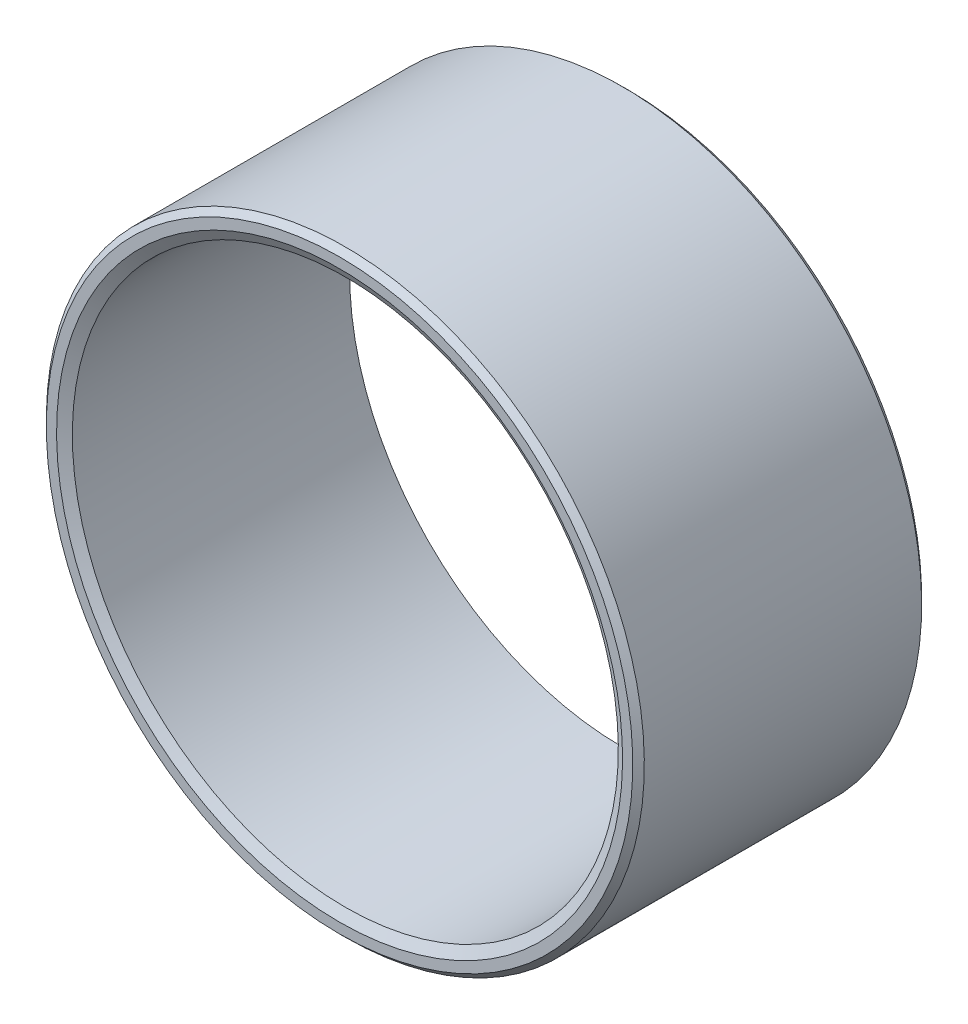
ISO-10303-21;
HEADER;
FILE_DESCRIPTION(('STEP AP214'),'2;1');
FILE_NAME('part.step','',(''),(''),'','','');
FILE_SCHEMA(('AUTOMOTIVE_DESIGN { 1 0 10303 214 1 1 1 1 }'));
ENDSEC;
DATA;
#1=APPLICATION_CONTEXT('core data for automotive mechanical design processes');
#2=APPLICATION_PROTOCOL_DEFINITION('international standard','automotive_design',2000,#1);
#3=PRODUCT_CONTEXT('',#1,'mechanical');
#4=PRODUCT('Part','Part','',(#3));
#5=PRODUCT_RELATED_PRODUCT_CATEGORY('part','',(#4));
#6=PRODUCT_DEFINITION_FORMATION('','',#4);
#7=PRODUCT_DEFINITION_CONTEXT('part definition',#1,'design');
#8=PRODUCT_DEFINITION('design','',#6,#7);
#9=PRODUCT_DEFINITION_SHAPE('','',#8);
#10=(LENGTH_UNIT() NAMED_UNIT(*) SI_UNIT(.MILLI.,.METRE.));
#11=(NAMED_UNIT(*) PLANE_ANGLE_UNIT() SI_UNIT($,.RADIAN.));
#12=(NAMED_UNIT(*) SI_UNIT($,.STERADIAN.) SOLID_ANGLE_UNIT());
#13=UNCERTAINTY_MEASURE_WITH_UNIT(LENGTH_MEASURE(1.E-05),#10,'distance_accuracy_value','');
#14=(GEOMETRIC_REPRESENTATION_CONTEXT(3) GLOBAL_UNCERTAINTY_ASSIGNED_CONTEXT((#13)) GLOBAL_UNIT_ASSIGNED_CONTEXT((#10,
#11,#12)) REPRESENTATION_CONTEXT('',''));
#15=CARTESIAN_POINT('',(0.,0.,0.));
#16=DIRECTION('',(0.,0.,1.));
#17=DIRECTION('',(1.,0.,0.));
#18=AXIS2_PLACEMENT_3D('',#15,#16,#17);
#19=CARTESIAN_POINT('',(0.,0.,0.));
#20=DIRECTION('',(0.,0.,1.));
#21=DIRECTION('',(0.,-1.,0.));
#22=AXIS2_PLACEMENT_3D('',#19,#20,#21);
#23=CONICAL_SURFACE('',#22,12.4414409051225,1.04719755119659);
#24=CARTESIAN_POINT('',(0.,0.,-0.254));
#25=DIRECTION('',(0.,0.,1.));
#26=DIRECTION('',(0.,-1.,0.));
#27=AXIS2_PLACEMENT_3D('',#24,#25,#26);
#28=CIRCLE('',#27,12.0015);
#29=CARTESIAN_POINT('',(0.,-12.0015,-0.254));
#30=VERTEX_POINT('',#29);
#31=EDGE_CURVE('E9',#30,#30,#28,.T.);
#32=ORIENTED_EDGE('',*,*,#31,.F.);
#33=EDGE_LOOP('',(#32));
#34=FACE_BOUND('',#33,.T.);
#35=CARTESIAN_POINT('',(0.,0.,0.));
#36=DIRECTION('',(0.,0.,1.));
#37=DIRECTION('',(0.,-1.,0.));
#38=AXIS2_PLACEMENT_3D('',#35,#36,#37);
#39=CIRCLE('',#38,12.4414409051225);
#40=CARTESIAN_POINT('',(0.,-12.4414409051225,0.));
#41=VERTEX_POINT('',#40);
#42=EDGE_CURVE('E42',#41,#41,#39,.T.);
#43=ORIENTED_EDGE('',*,*,#42,.T.);
#44=EDGE_LOOP('',(#43));
#45=FACE_BOUND('',#44,.T.);
#46=ADVANCED_FACE('F14',(#34,#45),#23,.F.);
#47=CARTESIAN_POINT('',(0.,0.,0.));
#48=DIRECTION('',(0.,0.,1.));
#49=DIRECTION('',(0.,-1.,0.));
#50=AXIS2_PLACEMENT_3D('',#47,#48,#49);
#51=CYLINDRICAL_SURFACE('',#50,12.0015);
#52=CARTESIAN_POINT('',(0.,0.,-12.446));
#53=DIRECTION('',(0.,0.,1.));
#54=DIRECTION('',(0.,-1.,0.));
#55=AXIS2_PLACEMENT_3D('',#52,#53,#54);
#56=CIRCLE('',#55,12.0015);
#57=CARTESIAN_POINT('',(0.,-12.0015,-12.446));
#58=VERTEX_POINT('',#57);
#59=EDGE_CURVE('E20',#58,#58,#56,.T.);
#60=ORIENTED_EDGE('',*,*,#59,.F.);
#61=EDGE_LOOP('',(#60));
#62=FACE_BOUND('',#61,.T.);
#63=ORIENTED_EDGE('',*,*,#31,.T.);
#64=EDGE_LOOP('',(#63));
#65=FACE_BOUND('',#64,.T.);
#66=ADVANCED_FACE('F79',(#62,#65),#51,.F.);
#67=CARTESIAN_POINT('',(0.,0.,-12.446));
#68=DIRECTION('',(0.,0.,-1.));
#69=DIRECTION('',(0.,1.,0.));
#70=AXIS2_PLACEMENT_3D('',#67,#68,#69);
#71=CONICAL_SURFACE('',#70,12.0015,1.04719755119659);
#72=CARTESIAN_POINT('',(0.,0.,-12.7));
#73=DIRECTION('',(0.,0.,1.));
#74=DIRECTION('',(0.,-1.,0.));
#75=AXIS2_PLACEMENT_3D('',#72,#73,#74);
#76=CIRCLE('',#75,12.4414409051225);
#77=CARTESIAN_POINT('',(0.,-12.4414409051225,-12.7));
#78=VERTEX_POINT('',#77);
#79=EDGE_CURVE('E24',#78,#78,#76,.T.);
#80=ORIENTED_EDGE('',*,*,#79,.F.);
#81=EDGE_LOOP('',(#80));
#82=FACE_BOUND('',#81,.T.);
#83=ORIENTED_EDGE('',*,*,#59,.T.);
#84=EDGE_LOOP('',(#83));
#85=FACE_BOUND('',#84,.T.);
#86=ADVANCED_FACE('F74',(#82,#85),#71,.F.);
#87=CARTESIAN_POINT('',(12.4414409051225,0.,-12.7));
#88=DIRECTION('',(0.,0.,1.));
#89=DIRECTION('',(0.,-1.,0.));
#90=AXIS2_PLACEMENT_3D('',#87,#88,#89);
#91=PLANE('',#90);
#92=CARTESIAN_POINT('',(0.,0.,-12.7));
#93=DIRECTION('',(0.,0.,1.));
#94=DIRECTION('',(0.,-1.,0.));
#95=AXIS2_PLACEMENT_3D('',#92,#93,#94);
#96=CIRCLE('',#95,12.8905);
#97=CARTESIAN_POINT('',(0.,-12.8905,-12.7));
#98=VERTEX_POINT('',#97);
#99=EDGE_CURVE('E28',#98,#98,#96,.T.);
#100=ORIENTED_EDGE('',*,*,#99,.F.);
#101=EDGE_LOOP('',(#100));
#102=FACE_BOUND('',#101,.T.);
#103=ORIENTED_EDGE('',*,*,#79,.T.);
#104=EDGE_LOOP('',(#103));
#105=FACE_BOUND('',#104,.T.);
#106=ADVANCED_FACE('F68',(#102,#105),#91,.F.);
#107=CARTESIAN_POINT('',(0.,0.,-12.7));
#108=DIRECTION('',(0.,0.,1.));
#109=DIRECTION('',(0.,-1.,0.));
#110=AXIS2_PLACEMENT_3D('',#107,#108,#109);
#111=CONICAL_SURFACE('',#110,12.8905,0.785398163397448);
#112=CARTESIAN_POINT('',(0.,0.,-12.446));
#113=DIRECTION('',(0.,0.,1.));
#114=DIRECTION('',(0.,-1.,0.));
#115=AXIS2_PLACEMENT_3D('',#112,#113,#114);
#116=CIRCLE('',#115,13.1445);
#117=CARTESIAN_POINT('',(0.,-13.1445,-12.446));
#118=VERTEX_POINT('',#117);
#119=EDGE_CURVE('E33',#118,#118,#116,.T.);
#120=ORIENTED_EDGE('',*,*,#119,.F.);
#121=EDGE_LOOP('',(#120));
#122=FACE_BOUND('',#121,.T.);
#123=ORIENTED_EDGE('',*,*,#99,.T.);
#124=EDGE_LOOP('',(#123));
#125=FACE_BOUND('',#124,.T.);
#126=ADVANCED_FACE('F62',(#122,#125),#111,.T.);
#127=CARTESIAN_POINT('',(0.,0.,0.));
#128=DIRECTION('',(0.,0.,1.));
#129=DIRECTION('',(0.,-1.,0.));
#130=AXIS2_PLACEMENT_3D('',#127,#128,#129);
#131=CYLINDRICAL_SURFACE('',#130,13.1445);
#132=CARTESIAN_POINT('',(0.,0.,-0.254));
#133=DIRECTION('',(0.,0.,1.));
#134=DIRECTION('',(0.,-1.,0.));
#135=AXIS2_PLACEMENT_3D('',#132,#133,#134);
#136=CIRCLE('',#135,13.1445);
#137=CARTESIAN_POINT('',(0.,-13.1445,-0.254));
#138=VERTEX_POINT('',#137);
#139=EDGE_CURVE('E36',#138,#138,#136,.T.);
#140=ORIENTED_EDGE('',*,*,#139,.F.);
#141=EDGE_LOOP('',(#140));
#142=FACE_BOUND('',#141,.T.);
#143=ORIENTED_EDGE('',*,*,#119,.T.);
#144=EDGE_LOOP('',(#143));
#145=FACE_BOUND('',#144,.T.);
#146=ADVANCED_FACE('F56',(#142,#145),#131,.T.);
#147=CARTESIAN_POINT('',(0.,0.,-0.254));
#148=DIRECTION('',(0.,0.,-1.));
#149=DIRECTION('',(0.,1.,0.));
#150=AXIS2_PLACEMENT_3D('',#147,#148,#149);
#151=CONICAL_SURFACE('',#150,13.1445,0.78539816339745);
#152=CARTESIAN_POINT('',(0.,0.,0.));
#153=DIRECTION('',(0.,0.,1.));
#154=DIRECTION('',(0.,-1.,0.));
#155=AXIS2_PLACEMENT_3D('',#152,#153,#154);
#156=CIRCLE('',#155,12.8905);
#157=CARTESIAN_POINT('',(0.,-12.8905,0.));
#158=VERTEX_POINT('',#157);
#159=EDGE_CURVE('E39',#158,#158,#156,.T.);
#160=ORIENTED_EDGE('',*,*,#159,.F.);
#161=EDGE_LOOP('',(#160));
#162=FACE_BOUND('',#161,.T.);
#163=ORIENTED_EDGE('',*,*,#139,.T.);
#164=EDGE_LOOP('',(#163));
#165=FACE_BOUND('',#164,.T.);
#166=ADVANCED_FACE('F50',(#162,#165),#151,.T.);
#167=CARTESIAN_POINT('',(12.4414409051225,0.,0.));
#168=DIRECTION('',(0.,0.,-1.));
#169=DIRECTION('',(0.,1.,0.));
#170=AXIS2_PLACEMENT_3D('',#167,#168,#169);
#171=PLANE('',#170);
#172=ORIENTED_EDGE('',*,*,#42,.F.);
#173=EDGE_LOOP('',(#172));
#174=FACE_BOUND('',#173,.T.);
#175=ORIENTED_EDGE('',*,*,#159,.T.);
#176=EDGE_LOOP('',(#175));
#177=FACE_BOUND('',#176,.T.);
#178=ADVANCED_FACE('F47',(#174,#177),#171,.F.);
#179=CLOSED_SHELL('',(#46,#66,#86,#106,#126,#146,#166,#178));
#180=MANIFOLD_SOLID_BREP('B1',#179);
#181=ADVANCED_BREP_SHAPE_REPRESENTATION('',(#18,#180),#14);
#182=SHAPE_DEFINITION_REPRESENTATION(#9,#181);
ENDSEC;
END-ISO-10303-21;
